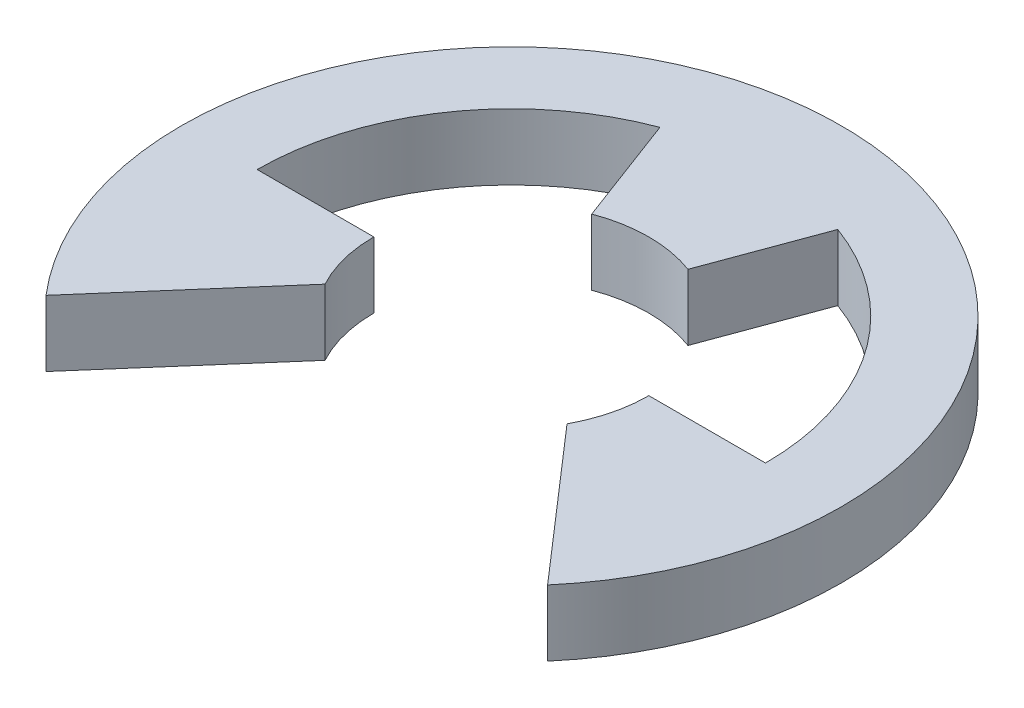
ISO-10303-21;
HEADER;
FILE_DESCRIPTION(('STEP AP214'),'2;1');
FILE_NAME('part.step','',(''),(''),'','','');
FILE_SCHEMA(('AUTOMOTIVE_DESIGN { 1 0 10303 214 1 1 1 1 }'));
ENDSEC;
DATA;
#1=APPLICATION_CONTEXT('core data for automotive mechanical design processes');
#2=APPLICATION_PROTOCOL_DEFINITION('international standard','automotive_design',2000,#1);
#3=PRODUCT_CONTEXT('',#1,'mechanical');
#4=PRODUCT('Part','Part','',(#3));
#5=PRODUCT_RELATED_PRODUCT_CATEGORY('part','',(#4));
#6=PRODUCT_DEFINITION_FORMATION('','',#4);
#7=PRODUCT_DEFINITION_CONTEXT('part definition',#1,'design');
#8=PRODUCT_DEFINITION('design','',#6,#7);
#9=PRODUCT_DEFINITION_SHAPE('','',#8);
#10=(LENGTH_UNIT() NAMED_UNIT(*) SI_UNIT(.MILLI.,.METRE.));
#11=(NAMED_UNIT(*) PLANE_ANGLE_UNIT() SI_UNIT($,.RADIAN.));
#12=(NAMED_UNIT(*) SI_UNIT($,.STERADIAN.) SOLID_ANGLE_UNIT());
#13=UNCERTAINTY_MEASURE_WITH_UNIT(LENGTH_MEASURE(1.E-05),#10,'distance_accuracy_value','');
#14=(GEOMETRIC_REPRESENTATION_CONTEXT(3) GLOBAL_UNCERTAINTY_ASSIGNED_CONTEXT((#13)) GLOBAL_UNIT_ASSIGNED_CONTEXT((#10,
#11,#12)) REPRESENTATION_CONTEXT('',''));
#15=CARTESIAN_POINT('',(0.,0.,0.));
#16=DIRECTION('',(0.,0.,1.));
#17=DIRECTION('',(1.,0.,0.));
#18=AXIS2_PLACEMENT_3D('',#15,#16,#17);
#19=CARTESIAN_POINT('',(0.,0.6,0.));
#20=DIRECTION('',(0.,-1.,0.));
#21=DIRECTION('',(0.,0.,-1.));
#22=AXIS2_PLACEMENT_3D('',#19,#20,#21);
#23=CYLINDRICAL_SURFACE('',#22,1.25);
#24=CARTESIAN_POINT('',(0.,0.,0.));
#25=DIRECTION('',(0.,-1.,0.));
#26=DIRECTION('',(0.,0.,-1.));
#27=AXIS2_PLACEMENT_3D('',#24,#25,#26);
#28=CIRCLE('',#27,1.25);
#29=CARTESIAN_POINT('',(1.25,0.,0.));
#30=VERTEX_POINT('',#29);
#31=CARTESIAN_POINT('',(1.1,0.,0.593717104351896));
#32=VERTEX_POINT('',#31);
#33=EDGE_CURVE('E159',#30,#32,#28,.T.);
#34=ORIENTED_EDGE('',*,*,#33,.T.);
#35=DIRECTION('',(0.,-1.,0.));
#36=VECTOR('',#35,1.);
#37=CARTESIAN_POINT('',(1.1,0.6,0.593717104351896));
#38=LINE('',#37,#36);
#39=CARTESIAN_POINT('',(1.1,0.6,0.593717104351896));
#40=VERTEX_POINT('',#39);
#41=EDGE_CURVE('E11',#40,#32,#38,.T.);
#42=ORIENTED_EDGE('',*,*,#41,.F.);
#43=CARTESIAN_POINT('',(0.,0.6,0.));
#44=DIRECTION('',(0.,-1.,0.));
#45=DIRECTION('',(0.,0.,-1.));
#46=AXIS2_PLACEMENT_3D('',#43,#44,#45);
#47=CIRCLE('',#46,1.25);
#48=CARTESIAN_POINT('',(1.25,0.6,0.));
#49=VERTEX_POINT('',#48);
#50=EDGE_CURVE('E181',#49,#40,#47,.T.);
#51=ORIENTED_EDGE('',*,*,#50,.F.);
#52=DIRECTION('',(0.,-1.,0.));
#53=VECTOR('',#52,1.);
#54=CARTESIAN_POINT('',(1.25,0.6,0.));
#55=LINE('',#54,#53);
#56=EDGE_CURVE('E155',#49,#30,#55,.T.);
#57=ORIENTED_EDGE('',*,*,#56,.T.);
#58=EDGE_LOOP('',(#34,#42,#51,#57));
#59=FACE_BOUND('',#58,.T.);
#60=ADVANCED_FACE('F39',(#59),#23,.F.);
#61=CARTESIAN_POINT('',(1.1,0.6,0.593717104351896));
#62=DIRECTION('',(0.754503192793571,0.,-0.656296375172305));
#63=DIRECTION('',(-0.656296375172305,0.,-0.754503192793571));
#64=AXIS2_PLACEMENT_3D('',#61,#62,#63);
#65=PLANE('',#64);
#66=DIRECTION('',(0.656296375172305,0.,0.754503192793571));
#67=VECTOR('',#66,1.);
#68=CARTESIAN_POINT('',(1.1,0.,0.593717104351896));
#69=LINE('',#68,#67);
#70=CARTESIAN_POINT('',(2.27977548533438,0.,1.95003172704149));
#71=VERTEX_POINT('',#70);
#72=EDGE_CURVE('E162',#32,#71,#69,.T.);
#73=ORIENTED_EDGE('',*,*,#72,.T.);
#74=DIRECTION('',(0.,-1.,0.));
#75=VECTOR('',#74,1.);
#76=CARTESIAN_POINT('',(2.27977548533438,0.6,1.95003172704149));
#77=LINE('',#76,#75);
#78=CARTESIAN_POINT('',(2.27977548533438,0.6,1.95003172704149));
#79=VERTEX_POINT('',#78);
#80=EDGE_CURVE('E47',#79,#71,#77,.T.);
#81=ORIENTED_EDGE('',*,*,#80,.F.);
#82=DIRECTION('',(0.656296375172305,0.,0.754503192793571));
#83=VECTOR('',#82,1.);
#84=CARTESIAN_POINT('',(1.1,0.6,0.593717104351896));
#85=LINE('',#84,#83);
#86=EDGE_CURVE('E110',#40,#79,#85,.T.);
#87=ORIENTED_EDGE('',*,*,#86,.F.);
#88=ORIENTED_EDGE('',*,*,#41,.T.);
#89=EDGE_LOOP('',(#73,#81,#87,#88));
#90=FACE_BOUND('',#89,.T.);
#91=ADVANCED_FACE('F259',(#90),#65,.F.);
#92=CARTESIAN_POINT('',(0.,0.6,0.));
#93=DIRECTION('',(0.,-1.,0.));
#94=DIRECTION('',(0.,0.,-1.));
#95=AXIS2_PLACEMENT_3D('',#92,#93,#94);
#96=CYLINDRICAL_SURFACE('',#95,3.);
#97=CARTESIAN_POINT('',(0.,0.,0.));
#98=DIRECTION('',(0.,1.,0.));
#99=DIRECTION('',(0.,0.,1.));
#100=AXIS2_PLACEMENT_3D('',#97,#98,#99);
#101=CIRCLE('',#100,3.);
#102=CARTESIAN_POINT('',(-2.27977548533438,0.,1.95003172704149));
#103=VERTEX_POINT('',#102);
#104=EDGE_CURVE('E164',#71,#103,#101,.T.);
#105=ORIENTED_EDGE('',*,*,#104,.T.);
#106=DIRECTION('',(0.,-1.,0.));
#107=VECTOR('',#106,1.);
#108=CARTESIAN_POINT('',(-2.27977548533438,0.6,1.95003172704149));
#109=LINE('',#108,#107);
#110=CARTESIAN_POINT('',(-2.27977548533438,0.6,1.95003172704149));
#111=VERTEX_POINT('',#110);
#112=EDGE_CURVE('E200',#111,#103,#109,.T.);
#113=ORIENTED_EDGE('',*,*,#112,.F.);
#114=CARTESIAN_POINT('',(0.,0.6,0.));
#115=DIRECTION('',(0.,1.,0.));
#116=DIRECTION('',(0.,0.,1.));
#117=AXIS2_PLACEMENT_3D('',#114,#115,#116);
#118=CIRCLE('',#117,3.);
#119=EDGE_CURVE('E208',#79,#111,#118,.T.);
#120=ORIENTED_EDGE('',*,*,#119,.F.);
#121=ORIENTED_EDGE('',*,*,#80,.T.);
#122=EDGE_LOOP('',(#105,#113,#120,#121));
#123=FACE_BOUND('',#122,.T.);
#124=ADVANCED_FACE('F206',(#123),#96,.T.);
#125=CARTESIAN_POINT('',(-1.1,0.6,0.593717104351896));
#126=DIRECTION('',(-0.754503192793571,0.,-0.656296375172305));
#127=DIRECTION('',(-0.656296375172305,0.,0.754503192793571));
#128=AXIS2_PLACEMENT_3D('',#125,#126,#127);
#129=PLANE('',#128);
#130=DIRECTION('',(0.656296375172305,0.,-0.754503192793571));
#131=VECTOR('',#130,1.);
#132=CARTESIAN_POINT('',(-1.1,0.,0.593717104351896));
#133=LINE('',#132,#131);
#134=CARTESIAN_POINT('',(-1.1,0.,0.593717104351896));
#135=VERTEX_POINT('',#134);
#136=EDGE_CURVE('E166',#103,#135,#133,.T.);
#137=ORIENTED_EDGE('',*,*,#136,.T.);
#138=DIRECTION('',(0.,-1.,0.));
#139=VECTOR('',#138,1.);
#140=CARTESIAN_POINT('',(-1.1,0.6,0.593717104351896));
#141=LINE('',#140,#139);
#142=CARTESIAN_POINT('',(-1.1,0.6,0.593717104351896));
#143=VERTEX_POINT('',#142);
#144=EDGE_CURVE('E197',#143,#135,#141,.T.);
#145=ORIENTED_EDGE('',*,*,#144,.F.);
#146=DIRECTION('',(0.656296375172305,0.,-0.754503192793571));
#147=VECTOR('',#146,1.);
#148=CARTESIAN_POINT('',(-1.1,0.6,0.593717104351896));
#149=LINE('',#148,#147);
#150=EDGE_CURVE('E226',#111,#143,#149,.T.);
#151=ORIENTED_EDGE('',*,*,#150,.F.);
#152=ORIENTED_EDGE('',*,*,#112,.T.);
#153=EDGE_LOOP('',(#137,#145,#151,#152));
#154=FACE_BOUND('',#153,.T.);
#155=ADVANCED_FACE('F217',(#154),#129,.F.);
#156=CARTESIAN_POINT('',(0.,0.6,0.));
#157=DIRECTION('',(0.,-1.,0.));
#158=DIRECTION('',(0.,0.,-1.));
#159=AXIS2_PLACEMENT_3D('',#156,#157,#158);
#160=CYLINDRICAL_SURFACE('',#159,1.25);
#161=CARTESIAN_POINT('',(0.,0.,0.));
#162=DIRECTION('',(0.,-1.,0.));
#163=DIRECTION('',(0.,0.,1.));
#164=AXIS2_PLACEMENT_3D('',#161,#162,#163);
#165=CIRCLE('',#164,1.25);
#166=CARTESIAN_POINT('',(-1.25,0.,0.));
#167=VERTEX_POINT('',#166);
#168=EDGE_CURVE('E168',#135,#167,#165,.T.);
#169=ORIENTED_EDGE('',*,*,#168,.T.);
#170=DIRECTION('',(0.,-1.,0.));
#171=VECTOR('',#170,1.);
#172=CARTESIAN_POINT('',(-1.25,0.6,0.));
#173=LINE('',#172,#171);
#174=CARTESIAN_POINT('',(-1.25,0.6,0.));
#175=VERTEX_POINT('',#174);
#176=EDGE_CURVE('E194',#175,#167,#173,.T.);
#177=ORIENTED_EDGE('',*,*,#176,.F.);
#178=CARTESIAN_POINT('',(0.,0.6,0.));
#179=DIRECTION('',(0.,-1.,0.));
#180=DIRECTION('',(0.,0.,1.));
#181=AXIS2_PLACEMENT_3D('',#178,#179,#180);
#182=CIRCLE('',#181,1.25);
#183=EDGE_CURVE('E223',#143,#175,#182,.T.);
#184=ORIENTED_EDGE('',*,*,#183,.F.);
#185=ORIENTED_EDGE('',*,*,#144,.T.);
#186=EDGE_LOOP('',(#169,#177,#184,#185));
#187=FACE_BOUND('',#186,.T.);
#188=ADVANCED_FACE('F221',(#187),#160,.F.);
#189=CARTESIAN_POINT('',(-1.25,0.6,0.));
#190=DIRECTION('',(0.,0.,1.));
#191=DIRECTION('',(1.,0.,0.));
#192=AXIS2_PLACEMENT_3D('',#189,#190,#191);
#193=PLANE('',#192);
#194=DIRECTION('',(-1.,0.,0.));
#195=VECTOR('',#194,1.);
#196=CARTESIAN_POINT('',(-1.25,0.,0.));
#197=LINE('',#196,#195);
#198=CARTESIAN_POINT('',(-2.31030851754699,0.,0.));
#199=VERTEX_POINT('',#198);
#200=EDGE_CURVE('E170',#167,#199,#197,.T.);
#201=ORIENTED_EDGE('',*,*,#200,.T.);
#202=DIRECTION('',(0.,-1.,0.));
#203=VECTOR('',#202,1.);
#204=CARTESIAN_POINT('',(-2.31030851754699,0.6,0.));
#205=LINE('',#204,#203);
#206=CARTESIAN_POINT('',(-2.31030851754699,0.6,0.));
#207=VERTEX_POINT('',#206);
#208=EDGE_CURVE('E191',#207,#199,#205,.T.);
#209=ORIENTED_EDGE('',*,*,#208,.F.);
#210=DIRECTION('',(-1.,0.,0.));
#211=VECTOR('',#210,1.);
#212=CARTESIAN_POINT('',(-1.25,0.6,0.));
#213=LINE('',#212,#211);
#214=EDGE_CURVE('E225',#175,#207,#213,.T.);
#215=ORIENTED_EDGE('',*,*,#214,.F.);
#216=ORIENTED_EDGE('',*,*,#176,.T.);
#217=EDGE_LOOP('',(#201,#209,#215,#216));
#218=FACE_BOUND('',#217,.T.);
#219=ADVANCED_FACE('F272',(#218),#193,.F.);
#220=CARTESIAN_POINT('',(0.,0.6,0.));
#221=DIRECTION('',(0.,-1.,0.));
#222=DIRECTION('',(0.,0.,-1.));
#223=AXIS2_PLACEMENT_3D('',#220,#221,#222);
#224=CYLINDRICAL_SURFACE('',#223,2.31030851754699);
#225=CARTESIAN_POINT('',(0.,0.,0.));
#226=DIRECTION('',(0.,-1.,0.));
#227=DIRECTION('',(0.,0.,1.));
#228=AXIS2_PLACEMENT_3D('',#225,#226,#227);
#229=CIRCLE('',#228,2.31030851754699);
#230=CARTESIAN_POINT('',(-0.811994496869913,0.,-2.16291247703257));
#231=VERTEX_POINT('',#230);
#232=EDGE_CURVE('E172',#199,#231,#229,.T.);
#233=ORIENTED_EDGE('',*,*,#232,.T.);
#234=DIRECTION('',(0.,-1.,0.));
#235=VECTOR('',#234,1.);
#236=CARTESIAN_POINT('',(-0.811994496869913,0.6,-2.16291247703257));
#237=LINE('',#236,#235);
#238=CARTESIAN_POINT('',(-0.811994496869913,0.6,-2.16291247703257));
#239=VERTEX_POINT('',#238);
#240=EDGE_CURVE('E188',#239,#231,#237,.T.);
#241=ORIENTED_EDGE('',*,*,#240,.F.);
#242=CARTESIAN_POINT('',(0.,0.6,0.));
#243=DIRECTION('',(0.,-1.,0.));
#244=DIRECTION('',(0.,0.,1.));
#245=AXIS2_PLACEMENT_3D('',#242,#243,#244);
#246=CIRCLE('',#245,2.31030851754699);
#247=EDGE_CURVE('E228',#207,#239,#246,.T.);
#248=ORIENTED_EDGE('',*,*,#247,.F.);
#249=ORIENTED_EDGE('',*,*,#208,.T.);
#250=EDGE_LOOP('',(#233,#241,#248,#249));
#251=FACE_BOUND('',#250,.T.);
#252=ADVANCED_FACE('F275',(#251),#224,.F.);
#253=CARTESIAN_POINT('',(-0.439332285440854,0.6,-1.17025088889918));
#254=DIRECTION('',(0.936200711119342,0.,-0.351465828352683));
#255=DIRECTION('',(-0.351465828352683,0.,-0.936200711119342));
#256=AXIS2_PLACEMENT_3D('',#253,#254,#255);
#257=PLANE('',#256);
#258=DIRECTION('',(0.351465828352683,0.,0.936200711119342));
#259=VECTOR('',#258,1.);
#260=CARTESIAN_POINT('',(-0.439332285440854,0.,-1.17025088889918));
#261=LINE('',#260,#259);
#262=CARTESIAN_POINT('',(-0.439332285440854,0.,-1.17025088889918));
#263=VERTEX_POINT('',#262);
#264=EDGE_CURVE('E174',#231,#263,#261,.T.);
#265=ORIENTED_EDGE('',*,*,#264,.T.);
#266=DIRECTION('',(0.,-1.,0.));
#267=VECTOR('',#266,1.);
#268=CARTESIAN_POINT('',(-0.439332285440854,0.6,-1.17025088889918));
#269=LINE('',#268,#267);
#270=CARTESIAN_POINT('',(-0.439332285440854,0.6,-1.17025088889918));
#271=VERTEX_POINT('',#270);
#272=EDGE_CURVE('E185',#271,#263,#269,.T.);
#273=ORIENTED_EDGE('',*,*,#272,.F.);
#274=DIRECTION('',(0.351465828352683,0.,0.936200711119342));
#275=VECTOR('',#274,1.);
#276=CARTESIAN_POINT('',(-0.439332285440854,0.6,-1.17025088889918));
#277=LINE('',#276,#275);
#278=EDGE_CURVE('E234',#239,#271,#277,.T.);
#279=ORIENTED_EDGE('',*,*,#278,.F.);
#280=ORIENTED_EDGE('',*,*,#240,.T.);
#281=EDGE_LOOP('',(#265,#273,#279,#280));
#282=FACE_BOUND('',#281,.T.);
#283=ADVANCED_FACE('F240',(#282),#257,.F.);
#284=CARTESIAN_POINT('',(0.,0.6,0.));
#285=DIRECTION('',(0.,-1.,0.));
#286=DIRECTION('',(0.,0.,-1.));
#287=AXIS2_PLACEMENT_3D('',#284,#285,#286);
#288=CYLINDRICAL_SURFACE('',#287,1.25000000000002);
#289=CARTESIAN_POINT('',(0.,0.,0.));
#290=DIRECTION('',(0.,-1.,0.));
#291=DIRECTION('',(0.,0.,1.));
#292=AXIS2_PLACEMENT_3D('',#289,#290,#291);
#293=CIRCLE('',#292,1.25000000000002);
#294=CARTESIAN_POINT('',(0.432811227016864,0.,-1.17267831981672));
#295=VERTEX_POINT('',#294);
#296=EDGE_CURVE('E176',#263,#295,#293,.T.);
#297=ORIENTED_EDGE('',*,*,#296,.T.);
#298=DIRECTION('',(0.,-1.,0.));
#299=VECTOR('',#298,1.);
#300=CARTESIAN_POINT('',(0.432811227016864,0.6,-1.17267831981672));
#301=LINE('',#300,#299);
#302=CARTESIAN_POINT('',(0.432811227016864,0.6,-1.17267831981672));
#303=VERTEX_POINT('',#302);
#304=EDGE_CURVE('E150',#303,#295,#301,.T.);
#305=ORIENTED_EDGE('',*,*,#304,.F.);
#306=CARTESIAN_POINT('',(0.,0.6,0.));
#307=DIRECTION('',(0.,-1.,0.));
#308=DIRECTION('',(0.,0.,1.));
#309=AXIS2_PLACEMENT_3D('',#306,#307,#308);
#310=CIRCLE('',#309,1.25000000000002);
#311=EDGE_CURVE('E141',#271,#303,#310,.T.);
#312=ORIENTED_EDGE('',*,*,#311,.F.);
#313=ORIENTED_EDGE('',*,*,#272,.T.);
#314=EDGE_LOOP('',(#297,#305,#312,#313));
#315=FACE_BOUND('',#314,.T.);
#316=ADVANCED_FACE('F244',(#315),#288,.F.);
#317=CARTESIAN_POINT('',(0.432811227016864,0.6,-1.17267831981672));
#318=DIRECTION('',(-0.938142655853373,0.,-0.346248981613491));
#319=DIRECTION('',(-0.346248981613491,0.,0.938142655853373));
#320=AXIS2_PLACEMENT_3D('',#317,#318,#319);
#321=PLANE('',#320);
#322=DIRECTION('',(0.346248981613491,0.,-0.938142655853373));
#323=VECTOR('',#322,1.);
#324=CARTESIAN_POINT('',(0.432811227016864,0.,-1.17267831981672));
#325=LINE('',#324,#323);
#326=CARTESIAN_POINT('',(0.79994197141362,0.,-2.1673989684922));
#327=VERTEX_POINT('',#326);
#328=EDGE_CURVE('E149',#295,#327,#325,.T.);
#329=ORIENTED_EDGE('',*,*,#328,.T.);
#330=DIRECTION('',(0.,-1.,0.));
#331=VECTOR('',#330,1.);
#332=CARTESIAN_POINT('',(0.79994197141362,0.6,-2.1673989684922));
#333=LINE('',#332,#331);
#334=CARTESIAN_POINT('',(0.79994197141362,0.6,-2.1673989684922));
#335=VERTEX_POINT('',#334);
#336=EDGE_CURVE('E146',#335,#327,#333,.T.);
#337=ORIENTED_EDGE('',*,*,#336,.F.);
#338=DIRECTION('',(0.346248981613491,0.,-0.938142655853373));
#339=VECTOR('',#338,1.);
#340=CARTESIAN_POINT('',(0.432811227016864,0.6,-1.17267831981672));
#341=LINE('',#340,#339);
#342=EDGE_CURVE('E135',#303,#335,#341,.T.);
#343=ORIENTED_EDGE('',*,*,#342,.F.);
#344=ORIENTED_EDGE('',*,*,#304,.T.);
#345=EDGE_LOOP('',(#329,#337,#343,#344));
#346=FACE_BOUND('',#345,.T.);
#347=ADVANCED_FACE('F147',(#346),#321,.F.);
#348=CARTESIAN_POINT('',(0.,0.6,0.));
#349=DIRECTION('',(0.,-1.,0.));
#350=DIRECTION('',(0.,0.,-1.));
#351=AXIS2_PLACEMENT_3D('',#348,#349,#350);
#352=CYLINDRICAL_SURFACE('',#351,2.31030851754699);
#353=CARTESIAN_POINT('',(0.,0.,0.));
#354=DIRECTION('',(0.,-1.,0.));
#355=DIRECTION('',(0.,0.,1.));
#356=AXIS2_PLACEMENT_3D('',#353,#354,#355);
#357=CIRCLE('',#356,2.31030851754699);
#358=CARTESIAN_POINT('',(2.31030851754699,0.,0.));
#359=VERTEX_POINT('',#358);
#360=EDGE_CURVE('E96',#327,#359,#357,.T.);
#361=ORIENTED_EDGE('',*,*,#360,.T.);
#362=DIRECTION('',(0.,-1.,0.));
#363=VECTOR('',#362,1.);
#364=CARTESIAN_POINT('',(2.31030851754699,0.6,0.));
#365=LINE('',#364,#363);
#366=CARTESIAN_POINT('',(2.31030851754699,0.6,0.));
#367=VERTEX_POINT('',#366);
#368=EDGE_CURVE('E151',#367,#359,#365,.T.);
#369=ORIENTED_EDGE('',*,*,#368,.F.);
#370=CARTESIAN_POINT('',(0.,0.6,0.));
#371=DIRECTION('',(0.,-1.,0.));
#372=DIRECTION('',(0.,0.,1.));
#373=AXIS2_PLACEMENT_3D('',#370,#371,#372);
#374=CIRCLE('',#373,2.31030851754699);
#375=EDGE_CURVE('E139',#335,#367,#374,.T.);
#376=ORIENTED_EDGE('',*,*,#375,.F.);
#377=ORIENTED_EDGE('',*,*,#336,.T.);
#378=EDGE_LOOP('',(#361,#369,#376,#377));
#379=FACE_BOUND('',#378,.T.);
#380=ADVANCED_FACE('F153',(#379),#352,.F.);
#381=CARTESIAN_POINT('',(1.25,0.6,0.));
#382=DIRECTION('',(0.,0.,1.));
#383=DIRECTION('',(1.,0.,0.));
#384=AXIS2_PLACEMENT_3D('',#381,#382,#383);
#385=PLANE('',#384);
#386=DIRECTION('',(-1.,0.,0.));
#387=VECTOR('',#386,1.);
#388=CARTESIAN_POINT('',(1.25,0.,0.));
#389=LINE('',#388,#387);
#390=EDGE_CURVE('E102',#359,#30,#389,.T.);
#391=ORIENTED_EDGE('',*,*,#390,.T.);
#392=ORIENTED_EDGE('',*,*,#56,.F.);
#393=DIRECTION('',(-1.,0.,0.));
#394=VECTOR('',#393,1.);
#395=CARTESIAN_POINT('',(1.25,0.6,0.));
#396=LINE('',#395,#394);
#397=EDGE_CURVE('E55',#367,#49,#396,.T.);
#398=ORIENTED_EDGE('',*,*,#397,.F.);
#399=ORIENTED_EDGE('',*,*,#368,.T.);
#400=EDGE_LOOP('',(#391,#392,#398,#399));
#401=FACE_BOUND('',#400,.T.);
#402=ADVANCED_FACE('F248',(#401),#385,.F.);
#403=CARTESIAN_POINT('',(0.,0.6,0.));
#404=DIRECTION('',(0.,-1.,0.));
#405=DIRECTION('',(0.,0.,-1.));
#406=AXIS2_PLACEMENT_3D('',#403,#404,#405);
#407=PLANE('',#406);
#408=ORIENTED_EDGE('',*,*,#50,.T.);
#409=ORIENTED_EDGE('',*,*,#86,.T.);
#410=ORIENTED_EDGE('',*,*,#119,.T.);
#411=ORIENTED_EDGE('',*,*,#150,.T.);
#412=ORIENTED_EDGE('',*,*,#183,.T.);
#413=ORIENTED_EDGE('',*,*,#214,.T.);
#414=ORIENTED_EDGE('',*,*,#247,.T.);
#415=ORIENTED_EDGE('',*,*,#278,.T.);
#416=ORIENTED_EDGE('',*,*,#311,.T.);
#417=ORIENTED_EDGE('',*,*,#342,.T.);
#418=ORIENTED_EDGE('',*,*,#375,.T.);
#419=ORIENTED_EDGE('',*,*,#397,.T.);
#420=EDGE_LOOP('',(#408,#409,#410,#411,#412,#413,#414,#415,#416,#417,#418,#419));
#421=FACE_BOUND('',#420,.T.);
#422=ADVANCED_FACE('F137',(#421),#407,.F.);
#423=CARTESIAN_POINT('',(0.,0.,0.));
#424=DIRECTION('',(0.,-1.,0.));
#425=DIRECTION('',(0.,0.,-1.));
#426=AXIS2_PLACEMENT_3D('',#423,#424,#425);
#427=PLANE('',#426);
#428=ORIENTED_EDGE('',*,*,#33,.F.);
#429=ORIENTED_EDGE('',*,*,#390,.F.);
#430=ORIENTED_EDGE('',*,*,#360,.F.);
#431=ORIENTED_EDGE('',*,*,#328,.F.);
#432=ORIENTED_EDGE('',*,*,#296,.F.);
#433=ORIENTED_EDGE('',*,*,#264,.F.);
#434=ORIENTED_EDGE('',*,*,#232,.F.);
#435=ORIENTED_EDGE('',*,*,#200,.F.);
#436=ORIENTED_EDGE('',*,*,#168,.F.);
#437=ORIENTED_EDGE('',*,*,#136,.F.);
#438=ORIENTED_EDGE('',*,*,#104,.F.);
#439=ORIENTED_EDGE('',*,*,#72,.F.);
#440=EDGE_LOOP('',(#428,#429,#430,#431,#432,#433,#434,#435,#436,#437,#438,#439));
#441=FACE_BOUND('',#440,.T.);
#442=ADVANCED_FACE('F212',(#441),#427,.T.);
#443=CLOSED_SHELL('',(#60,#91,#124,#155,#188,#219,#252,#283,#316,#347,#380,#402,#422,#442));
#444=MANIFOLD_SOLID_BREP('B2',#443);
#445=ADVANCED_BREP_SHAPE_REPRESENTATION('',(#18,#444),#14);
#446=SHAPE_DEFINITION_REPRESENTATION(#9,#445);
ENDSEC;
END-ISO-10303-21;
